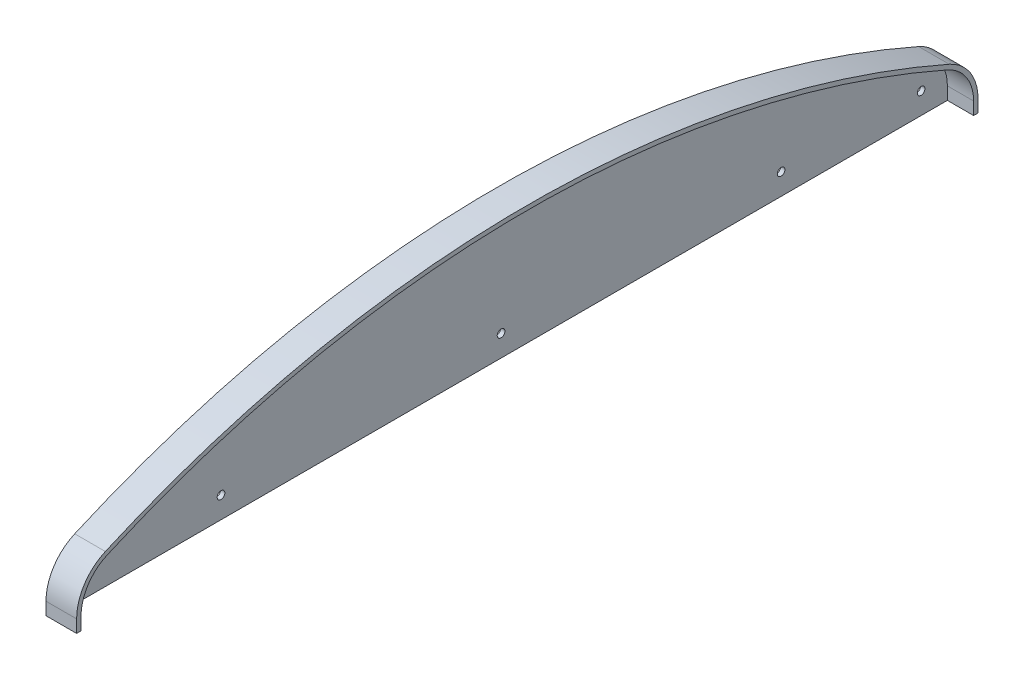
ISO-10303-21;
HEADER;
FILE_DESCRIPTION(('STEP AP214'),'2;1');
FILE_NAME('part.step','',(''),(''),'','','');
FILE_SCHEMA(('AUTOMOTIVE_DESIGN { 1 0 10303 214 1 1 1 1 }'));
ENDSEC;
DATA;
#1=APPLICATION_CONTEXT('core data for automotive mechanical design processes');
#2=APPLICATION_PROTOCOL_DEFINITION('international standard','automotive_design',2000,#1);
#3=PRODUCT_CONTEXT('',#1,'mechanical');
#4=PRODUCT('Part','Part','',(#3));
#5=PRODUCT_RELATED_PRODUCT_CATEGORY('part','',(#4));
#6=PRODUCT_DEFINITION_FORMATION('','',#4);
#7=PRODUCT_DEFINITION_CONTEXT('part definition',#1,'design');
#8=PRODUCT_DEFINITION('design','',#6,#7);
#9=PRODUCT_DEFINITION_SHAPE('','',#8);
#10=(LENGTH_UNIT() NAMED_UNIT(*) SI_UNIT(.MILLI.,.METRE.));
#11=(NAMED_UNIT(*) PLANE_ANGLE_UNIT() SI_UNIT($,.RADIAN.));
#12=(NAMED_UNIT(*) SI_UNIT($,.STERADIAN.) SOLID_ANGLE_UNIT());
#13=UNCERTAINTY_MEASURE_WITH_UNIT(LENGTH_MEASURE(1.E-05),#10,'distance_accuracy_value','');
#14=(GEOMETRIC_REPRESENTATION_CONTEXT(3) GLOBAL_UNCERTAINTY_ASSIGNED_CONTEXT((#13)) GLOBAL_UNIT_ASSIGNED_CONTEXT((#10,
#11,#12)) REPRESENTATION_CONTEXT('',''));
#15=CARTESIAN_POINT('',(0.,0.,0.));
#16=DIRECTION('',(0.,0.,1.));
#17=DIRECTION('',(1.,0.,0.));
#18=AXIS2_PLACEMENT_3D('',#15,#16,#17);
#19=CARTESIAN_POINT('',(28.575,0.,-292.1));
#20=DIRECTION('',(-1.,0.,0.));
#21=DIRECTION('',(0.,0.,1.));
#22=AXIS2_PLACEMENT_3D('',#19,#20,#21);
#23=CYLINDRICAL_SURFACE('',#22,31.75);
#24=CARTESIAN_POINT('',(22.225,0.,-292.1));
#25=DIRECTION('',(-1.,0.,0.));
#26=DIRECTION('',(0.,0.,1.));
#27=AXIS2_PLACEMENT_3D('',#24,#25,#26);
#28=CIRCLE('',#27,31.75);
#29=CARTESIAN_POINT('',(22.225,29.0504808933824,-304.911403508753));
#30=VERTEX_POINT('',#29);
#31=CARTESIAN_POINT('',(22.225,-1.0807521544365E-12,-323.85));
#32=VERTEX_POINT('',#31);
#33=EDGE_CURVE('E114',#30,#32,#28,.T.);
#34=ORIENTED_EDGE('',*,*,#33,.F.);
#35=DIRECTION('',(-1.,0.,0.));
#36=VECTOR('',#35,1.);
#37=CARTESIAN_POINT('',(28.575,29.0504808933932,-304.911403508729));
#38=LINE('',#37,#36);
#39=CARTESIAN_POINT('',(3.175,29.0504808933761,-304.911403508751));
#40=VERTEX_POINT('',#39);
#41=EDGE_CURVE('E102',#30,#40,#38,.T.);
#42=ORIENTED_EDGE('',*,*,#41,.T.);
#43=CARTESIAN_POINT('',(3.175,0.,-292.1));
#44=DIRECTION('',(-1.,0.,0.));
#45=DIRECTION('',(0.,0.,1.));
#46=AXIS2_PLACEMENT_3D('',#43,#44,#45);
#47=CIRCLE('',#46,31.75);
#48=CARTESIAN_POINT('',(3.175,-1.0807521544365E-12,-323.85));
#49=VERTEX_POINT('',#48);
#50=EDGE_CURVE('E118',#49,#40,#47,.F.);
#51=ORIENTED_EDGE('',*,*,#50,.F.);
#52=DIRECTION('',(1.,0.,0.));
#53=VECTOR('',#52,1.);
#54=CARTESIAN_POINT('',(22.225,-2.16150430887301E-12,-323.85));
#55=LINE('',#54,#53);
#56=EDGE_CURVE('E169',#32,#49,#55,.F.);
#57=ORIENTED_EDGE('',*,*,#56,.F.);
#58=EDGE_LOOP('',(#34,#42,#51,#57));
#59=FACE_BOUND('',#58,.T.);
#60=ADVANCED_FACE('F16',(#59),#23,.F.);
#61=CARTESIAN_POINT('',(28.575,-662.350964368574,0.));
#62=DIRECTION('',(-1.,0.,0.));
#63=DIRECTION('',(0.,0.,1.));
#64=AXIS2_PLACEMENT_3D('',#61,#62,#63);
#65=CYLINDRICAL_SURFACE('',#64,755.65);
#66=CARTESIAN_POINT('',(22.225,-662.350964368574,0.));
#67=DIRECTION('',(-1.,0.,0.));
#68=DIRECTION('',(0.,0.,1.));
#69=AXIS2_PLACEMENT_3D('',#66,#67,#68);
#70=CIRCLE('',#69,755.65);
#71=CARTESIAN_POINT('',(22.225,29.0504808933702,304.911403508748));
#72=VERTEX_POINT('',#71);
#73=EDGE_CURVE('E108',#72,#30,#70,.T.);
#74=ORIENTED_EDGE('',*,*,#73,.F.);
#75=DIRECTION('',(-1.,0.,0.));
#76=VECTOR('',#75,1.);
#77=CARTESIAN_POINT('',(28.575,29.0504808933809,304.911403508723));
#78=LINE('',#77,#76);
#79=CARTESIAN_POINT('',(3.175,29.0504808933763,304.911403508751));
#80=VERTEX_POINT('',#79);
#81=EDGE_CURVE('E95',#72,#80,#78,.T.);
#82=ORIENTED_EDGE('',*,*,#81,.T.);
#83=CARTESIAN_POINT('',(3.175,-662.350964368574,0.));
#84=DIRECTION('',(-1.,0.,0.));
#85=DIRECTION('',(0.,0.,1.));
#86=AXIS2_PLACEMENT_3D('',#83,#84,#85);
#87=CIRCLE('',#86,755.65);
#88=EDGE_CURVE('E120',#40,#80,#87,.F.);
#89=ORIENTED_EDGE('',*,*,#88,.F.);
#90=ORIENTED_EDGE('',*,*,#41,.F.);
#91=EDGE_LOOP('',(#74,#82,#89,#90));
#92=FACE_BOUND('',#91,.T.);
#93=ADVANCED_FACE('F112',(#92),#65,.F.);
#94=CARTESIAN_POINT('',(28.575,3.4967584383589E-13,292.1));
#95=DIRECTION('',(-1.,0.,0.));
#96=DIRECTION('',(0.,0.,1.));
#97=AXIS2_PLACEMENT_3D('',#94,#95,#96);
#98=CYLINDRICAL_SURFACE('',#97,31.75);
#99=CARTESIAN_POINT('',(22.225,3.4967584383589E-13,292.1));
#100=DIRECTION('',(-1.,0.,0.));
#101=DIRECTION('',(0.,0.,1.));
#102=AXIS2_PLACEMENT_3D('',#99,#100,#101);
#103=CIRCLE('',#102,31.75);
#104=CARTESIAN_POINT('',(22.225,1.74837921917945E-13,323.85));
#105=VERTEX_POINT('',#104);
#106=EDGE_CURVE('E19',#105,#72,#103,.T.);
#107=ORIENTED_EDGE('',*,*,#106,.F.);
#108=DIRECTION('',(-1.,0.,0.));
#109=VECTOR('',#108,1.);
#110=CARTESIAN_POINT('',(22.225,0.,323.85));
#111=LINE('',#110,#109);
#112=CARTESIAN_POINT('',(3.175,1.74837921917945E-13,323.85));
#113=VERTEX_POINT('',#112);
#114=EDGE_CURVE('E88',#113,#105,#111,.F.);
#115=ORIENTED_EDGE('',*,*,#114,.F.);
#116=CARTESIAN_POINT('',(3.175,3.4967584383589E-13,292.1));
#117=DIRECTION('',(-1.,0.,0.));
#118=DIRECTION('',(0.,0.,1.));
#119=AXIS2_PLACEMENT_3D('',#116,#117,#118);
#120=CIRCLE('',#119,31.75);
#121=EDGE_CURVE('E98',#80,#113,#120,.F.);
#122=ORIENTED_EDGE('',*,*,#121,.F.);
#123=ORIENTED_EDGE('',*,*,#81,.F.);
#124=EDGE_LOOP('',(#107,#115,#122,#123));
#125=FACE_BOUND('',#124,.T.);
#126=ADVANCED_FACE('F97',(#125),#98,.F.);
#127=CARTESIAN_POINT('',(22.225,-9.144,323.85));
#128=DIRECTION('',(0.,0.,-1.));
#129=DIRECTION('',(-1.,0.,0.));
#130=AXIS2_PLACEMENT_3D('',#127,#128,#129);
#131=PLANE('',#130);
#132=DIRECTION('',(1.,0.,0.));
#133=VECTOR('',#132,1.);
#134=CARTESIAN_POINT('',(0.,-9.144,323.85));
#135=LINE('',#134,#133);
#136=CARTESIAN_POINT('',(3.175,-9.144,323.85));
#137=VERTEX_POINT('',#136);
#138=CARTESIAN_POINT('',(22.225,-9.144,323.85));
#139=VERTEX_POINT('',#138);
#140=EDGE_CURVE('E182',#137,#139,#135,.T.);
#141=ORIENTED_EDGE('',*,*,#140,.F.);
#142=DIRECTION('',(0.,1.,0.));
#143=VECTOR('',#142,1.);
#144=CARTESIAN_POINT('',(3.175,0.,323.85));
#145=LINE('',#144,#143);
#146=EDGE_CURVE('E124',#113,#137,#145,.F.);
#147=ORIENTED_EDGE('',*,*,#146,.F.);
#148=ORIENTED_EDGE('',*,*,#114,.T.);
#149=DIRECTION('',(0.,1.,0.));
#150=VECTOR('',#149,1.);
#151=CARTESIAN_POINT('',(22.225,-9.144,323.85));
#152=LINE('',#151,#150);
#153=EDGE_CURVE('E111',#139,#105,#152,.T.);
#154=ORIENTED_EDGE('',*,*,#153,.F.);
#155=EDGE_LOOP('',(#141,#147,#148,#154));
#156=FACE_BOUND('',#155,.T.);
#157=ADVANCED_FACE('F285',(#156),#131,.T.);
#158=CARTESIAN_POINT('',(22.225,3.89155374591682E-13,-323.85));
#159=DIRECTION('',(0.,0.,1.));
#160=DIRECTION('',(1.,0.,0.));
#161=AXIS2_PLACEMENT_3D('',#158,#159,#160);
#162=PLANE('',#161);
#163=ORIENTED_EDGE('',*,*,#56,.T.);
#164=DIRECTION('',(0.,1.,0.));
#165=VECTOR('',#164,1.);
#166=CARTESIAN_POINT('',(3.175,0.,-323.85));
#167=LINE('',#166,#165);
#168=CARTESIAN_POINT('',(3.175,-9.144,-323.85));
#169=VERTEX_POINT('',#168);
#170=EDGE_CURVE('E121',#169,#49,#167,.T.);
#171=ORIENTED_EDGE('',*,*,#170,.F.);
#172=DIRECTION('',(1.,0.,0.));
#173=VECTOR('',#172,1.);
#174=CARTESIAN_POINT('',(0.,-9.144,-323.85));
#175=LINE('',#174,#173);
#176=CARTESIAN_POINT('',(22.225,-9.144,-323.85));
#177=VERTEX_POINT('',#176);
#178=EDGE_CURVE('E179',#177,#169,#175,.F.);
#179=ORIENTED_EDGE('',*,*,#178,.F.);
#180=DIRECTION('',(0.,1.,0.));
#181=VECTOR('',#180,1.);
#182=CARTESIAN_POINT('',(22.225,-9.144,-323.85));
#183=LINE('',#182,#181);
#184=EDGE_CURVE('E115',#32,#177,#183,.F.);
#185=ORIENTED_EDGE('',*,*,#184,.F.);
#186=EDGE_LOOP('',(#163,#171,#179,#185));
#187=FACE_BOUND('',#186,.T.);
#188=ADVANCED_FACE('F278',(#187),#162,.T.);
#189=CARTESIAN_POINT('',(22.225,-9.144,327.025));
#190=DIRECTION('',(1.,0.,0.));
#191=DIRECTION('',(0.,0.,-1.));
#192=AXIS2_PLACEMENT_3D('',#189,#190,#191);
#193=PLANE('',#192);
#194=DIRECTION('',(0.,1.,0.));
#195=VECTOR('',#194,1.);
#196=CARTESIAN_POINT('',(22.225,0.,327.025));
#197=LINE('',#196,#195);
#198=CARTESIAN_POINT('',(22.225,-9.144,327.025));
#199=VERTEX_POINT('',#198);
#200=CARTESIAN_POINT('',(22.225,0.,327.025));
#201=VERTEX_POINT('',#200);
#202=EDGE_CURVE('E194',#199,#201,#197,.T.);
#203=ORIENTED_EDGE('',*,*,#202,.F.);
#204=DIRECTION('',(0.,0.,-1.));
#205=VECTOR('',#204,1.);
#206=CARTESIAN_POINT('',(22.225,-9.144,327.025));
#207=LINE('',#206,#205);
#208=EDGE_CURVE('E185',#139,#199,#207,.F.);
#209=ORIENTED_EDGE('',*,*,#208,.F.);
#210=ORIENTED_EDGE('',*,*,#153,.T.);
#211=ORIENTED_EDGE('',*,*,#106,.T.);
#212=ORIENTED_EDGE('',*,*,#73,.T.);
#213=ORIENTED_EDGE('',*,*,#33,.T.);
#214=ORIENTED_EDGE('',*,*,#184,.T.);
#215=DIRECTION('',(0.,0.,-1.));
#216=VECTOR('',#215,1.);
#217=CARTESIAN_POINT('',(22.225,-9.144,327.025));
#218=LINE('',#217,#216);
#219=CARTESIAN_POINT('',(22.225,-9.144,-327.025));
#220=VERTEX_POINT('',#219);
#221=EDGE_CURVE('E200',#220,#177,#218,.F.);
#222=ORIENTED_EDGE('',*,*,#221,.F.);
#223=DIRECTION('',(0.,1.,0.));
#224=VECTOR('',#223,1.);
#225=CARTESIAN_POINT('',(22.225,-9.144,-327.025));
#226=LINE('',#225,#224);
#227=CARTESIAN_POINT('',(22.225,0.,-327.025));
#228=VERTEX_POINT('',#227);
#229=EDGE_CURVE('E178',#228,#220,#226,.F.);
#230=ORIENTED_EDGE('',*,*,#229,.F.);
#231=CARTESIAN_POINT('',(22.225,0.,-292.1));
#232=DIRECTION('',(1.,0.,0.));
#233=DIRECTION('',(0.,0.,-1.));
#234=AXIS2_PLACEMENT_3D('',#231,#232,#233);
#235=CIRCLE('',#234,34.925);
#236=CARTESIAN_POINT('',(22.225,31.9555289827176,-306.192543859615));
#237=VERTEX_POINT('',#236);
#238=EDGE_CURVE('E130',#237,#228,#235,.F.);
#239=ORIENTED_EDGE('',*,*,#238,.F.);
#240=CARTESIAN_POINT('',(22.225,-662.350964368574,0.));
#241=DIRECTION('',(1.,0.,0.));
#242=DIRECTION('',(0.,0.,-1.));
#243=AXIS2_PLACEMENT_3D('',#240,#241,#242);
#244=CIRCLE('',#243,758.825);
#245=CARTESIAN_POINT('',(22.225,31.9555289827113,306.192543859612));
#246=VERTEX_POINT('',#245);
#247=EDGE_CURVE('E125',#246,#237,#244,.F.);
#248=ORIENTED_EDGE('',*,*,#247,.F.);
#249=CARTESIAN_POINT('',(22.225,0.,292.1));
#250=DIRECTION('',(1.,0.,0.));
#251=DIRECTION('',(0.,0.,-1.));
#252=AXIS2_PLACEMENT_3D('',#249,#250,#251);
#253=CIRCLE('',#252,34.925);
#254=EDGE_CURVE('E127',#201,#246,#253,.F.);
#255=ORIENTED_EDGE('',*,*,#254,.F.);
#256=EDGE_LOOP('',(#203,#209,#210,#211,#212,#213,#214,#222,#230,#239,#248,#255));
#257=FACE_BOUND('',#256,.T.);
#258=ADVANCED_FACE('F107',(#257),#193,.T.);
#259=CARTESIAN_POINT('',(3.175,0.,0.));
#260=DIRECTION('',(1.,0.,0.));
#261=DIRECTION('',(0.,0.,-1.));
#262=AXIS2_PLACEMENT_3D('',#259,#260,#261);
#263=PLANE('',#262);
#264=CARTESIAN_POINT('',(3.175,6.35,-203.2));
#265=DIRECTION('',(-1.,0.,0.));
#266=DIRECTION('',(0.,0.,1.));
#267=AXIS2_PLACEMENT_3D('',#264,#265,#266);
#268=CIRCLE('',#267,2.7813);
#269=CARTESIAN_POINT('',(3.175,6.35,-200.4187));
#270=VERTEX_POINT('',#269);
#271=EDGE_CURVE('E145',#270,#270,#268,.T.);
#272=ORIENTED_EDGE('',*,*,#271,.T.);
#273=EDGE_LOOP('',(#272));
#274=FACE_BOUND('',#273,.T.);
#275=CARTESIAN_POINT('',(3.175,6.35,-304.8));
#276=DIRECTION('',(-1.,0.,0.));
#277=DIRECTION('',(0.,0.,1.));
#278=AXIS2_PLACEMENT_3D('',#275,#276,#277);
#279=CIRCLE('',#278,2.7813);
#280=CARTESIAN_POINT('',(3.175,6.35,-302.0187));
#281=VERTEX_POINT('',#280);
#282=EDGE_CURVE('E142',#281,#281,#279,.T.);
#283=ORIENTED_EDGE('',*,*,#282,.T.);
#284=EDGE_LOOP('',(#283));
#285=FACE_BOUND('',#284,.T.);
#286=CARTESIAN_POINT('',(3.175,6.35,203.2));
#287=DIRECTION('',(-1.,0.,0.));
#288=DIRECTION('',(0.,0.,1.));
#289=AXIS2_PLACEMENT_3D('',#286,#287,#288);
#290=CIRCLE('',#289,2.7813);
#291=CARTESIAN_POINT('',(3.175,6.35,205.9813));
#292=VERTEX_POINT('',#291);
#293=EDGE_CURVE('E139',#292,#292,#290,.T.);
#294=ORIENTED_EDGE('',*,*,#293,.T.);
#295=EDGE_LOOP('',(#294));
#296=FACE_BOUND('',#295,.T.);
#297=CARTESIAN_POINT('',(3.175,6.35,304.8));
#298=DIRECTION('',(-1.,0.,0.));
#299=DIRECTION('',(0.,0.,1.));
#300=AXIS2_PLACEMENT_3D('',#297,#298,#299);
#301=CIRCLE('',#300,2.7813);
#302=CARTESIAN_POINT('',(3.175,6.35,307.5813));
#303=VERTEX_POINT('',#302);
#304=EDGE_CURVE('E136',#303,#303,#301,.T.);
#305=ORIENTED_EDGE('',*,*,#304,.T.);
#306=EDGE_LOOP('',(#305));
#307=FACE_BOUND('',#306,.T.);
#308=CARTESIAN_POINT('',(3.175,6.35,0.));
#309=DIRECTION('',(-1.,0.,0.));
#310=DIRECTION('',(0.,0.,1.));
#311=AXIS2_PLACEMENT_3D('',#308,#309,#310);
#312=CIRCLE('',#311,2.7813);
#313=CARTESIAN_POINT('',(3.175,6.35,2.7813));
#314=VERTEX_POINT('',#313);
#315=EDGE_CURVE('E133',#314,#314,#312,.T.);
#316=ORIENTED_EDGE('',*,*,#315,.T.);
#317=EDGE_LOOP('',(#316));
#318=FACE_BOUND('',#317,.T.);
#319=ORIENTED_EDGE('',*,*,#121,.T.);
#320=ORIENTED_EDGE('',*,*,#146,.T.);
#321=DIRECTION('',(0.,0.,-1.));
#322=VECTOR('',#321,1.);
#323=CARTESIAN_POINT('',(3.175,-9.144,327.025));
#324=LINE('',#323,#322);
#325=EDGE_CURVE('E175',#169,#137,#324,.F.);
#326=ORIENTED_EDGE('',*,*,#325,.F.);
#327=ORIENTED_EDGE('',*,*,#170,.T.);
#328=ORIENTED_EDGE('',*,*,#50,.T.);
#329=ORIENTED_EDGE('',*,*,#88,.T.);
#330=EDGE_LOOP('',(#319,#320,#326,#327,#328,#329));
#331=FACE_BOUND('',#330,.T.);
#332=ADVANCED_FACE('F283',(#274,#285,#296,#307,#318,#331),#263,.T.);
#333=CARTESIAN_POINT('',(0.,-662.350964368574,0.));
#334=DIRECTION('',(1.,0.,0.));
#335=DIRECTION('',(0.,0.,-1.));
#336=AXIS2_PLACEMENT_3D('',#333,#334,#335);
#337=CYLINDRICAL_SURFACE('',#336,758.825);
#338=ORIENTED_EDGE('',*,*,#247,.T.);
#339=DIRECTION('',(1.,0.,0.));
#340=VECTOR('',#339,1.);
#341=CARTESIAN_POINT('',(0.,31.9555289827276,-306.192543859575));
#342=LINE('',#341,#340);
#343=CARTESIAN_POINT('',(0.,31.9555289827176,-306.192543859615));
#344=VERTEX_POINT('',#343);
#345=EDGE_CURVE('E132',#344,#237,#342,.T.);
#346=ORIENTED_EDGE('',*,*,#345,.F.);
#347=CARTESIAN_POINT('',(0.,-662.350964368574,0.));
#348=DIRECTION('',(1.,0.,0.));
#349=DIRECTION('',(0.,0.,-1.));
#350=AXIS2_PLACEMENT_3D('',#347,#348,#349);
#351=CIRCLE('',#350,758.825);
#352=CARTESIAN_POINT('',(0.,31.9555289827113,306.192543859612));
#353=VERTEX_POINT('',#352);
#354=EDGE_CURVE('E148',#344,#353,#351,.T.);
#355=ORIENTED_EDGE('',*,*,#354,.T.);
#356=DIRECTION('',(1.,0.,0.));
#357=VECTOR('',#356,1.);
#358=CARTESIAN_POINT('',(0.,31.9555289827276,306.192543859575));
#359=LINE('',#358,#357);
#360=EDGE_CURVE('E129',#246,#353,#359,.F.);
#361=ORIENTED_EDGE('',*,*,#360,.F.);
#362=EDGE_LOOP('',(#338,#346,#355,#361));
#363=FACE_BOUND('',#362,.T.);
#364=ADVANCED_FACE('F294',(#363),#337,.T.);
#365=CARTESIAN_POINT('',(0.,0.,292.1));
#366=DIRECTION('',(1.,0.,0.));
#367=DIRECTION('',(0.,0.,-1.));
#368=AXIS2_PLACEMENT_3D('',#365,#366,#367);
#369=CYLINDRICAL_SURFACE('',#368,34.925);
#370=ORIENTED_EDGE('',*,*,#254,.T.);
#371=ORIENTED_EDGE('',*,*,#360,.T.);
#372=CARTESIAN_POINT('',(0.,0.,292.1));
#373=DIRECTION('',(1.,0.,0.));
#374=DIRECTION('',(0.,0.,-1.));
#375=AXIS2_PLACEMENT_3D('',#372,#373,#374);
#376=CIRCLE('',#375,34.925);
#377=CARTESIAN_POINT('',(0.,0.,327.025));
#378=VERTEX_POINT('',#377);
#379=EDGE_CURVE('E151',#353,#378,#376,.T.);
#380=ORIENTED_EDGE('',*,*,#379,.T.);
#381=DIRECTION('',(1.,0.,0.));
#382=VECTOR('',#381,1.);
#383=CARTESIAN_POINT('',(0.,0.,327.025));
#384=LINE('',#383,#382);
#385=EDGE_CURVE('E186',#201,#378,#384,.F.);
#386=ORIENTED_EDGE('',*,*,#385,.F.);
#387=EDGE_LOOP('',(#370,#371,#380,#386));
#388=FACE_BOUND('',#387,.T.);
#389=ADVANCED_FACE('F290',(#388),#369,.T.);
#390=CARTESIAN_POINT('',(0.,0.,327.025));
#391=DIRECTION('',(0.,0.,1.));
#392=DIRECTION('',(1.,0.,0.));
#393=AXIS2_PLACEMENT_3D('',#390,#391,#392);
#394=PLANE('',#393);
#395=ORIENTED_EDGE('',*,*,#202,.T.);
#396=ORIENTED_EDGE('',*,*,#385,.T.);
#397=DIRECTION('',(0.,1.,0.));
#398=VECTOR('',#397,1.);
#399=CARTESIAN_POINT('',(0.,0.,327.025));
#400=LINE('',#399,#398);
#401=CARTESIAN_POINT('',(0.,-9.144,327.025));
#402=VERTEX_POINT('',#401);
#403=EDGE_CURVE('E154',#378,#402,#400,.F.);
#404=ORIENTED_EDGE('',*,*,#403,.T.);
#405=DIRECTION('',(1.,0.,0.));
#406=VECTOR('',#405,1.);
#407=CARTESIAN_POINT('',(0.,-9.144,327.025));
#408=LINE('',#407,#406);
#409=EDGE_CURVE('E191',#199,#402,#408,.F.);
#410=ORIENTED_EDGE('',*,*,#409,.F.);
#411=EDGE_LOOP('',(#395,#396,#404,#410));
#412=FACE_BOUND('',#411,.T.);
#413=ADVANCED_FACE('F263',(#412),#394,.T.);
#414=CARTESIAN_POINT('',(0.,-9.144,327.025));
#415=DIRECTION('',(0.,-1.,0.));
#416=DIRECTION('',(0.,0.,-1.));
#417=AXIS2_PLACEMENT_3D('',#414,#415,#416);
#418=PLANE('',#417);
#419=ORIENTED_EDGE('',*,*,#178,.T.);
#420=ORIENTED_EDGE('',*,*,#325,.T.);
#421=ORIENTED_EDGE('',*,*,#140,.T.);
#422=ORIENTED_EDGE('',*,*,#208,.T.);
#423=ORIENTED_EDGE('',*,*,#409,.T.);
#424=DIRECTION('',(0.,0.,-1.));
#425=VECTOR('',#424,1.);
#426=CARTESIAN_POINT('',(0.,-9.144,0.));
#427=LINE('',#426,#425);
#428=CARTESIAN_POINT('',(0.,-9.144,-327.025));
#429=VERTEX_POINT('',#428);
#430=EDGE_CURVE('E233',#402,#429,#427,.T.);
#431=ORIENTED_EDGE('',*,*,#430,.T.);
#432=DIRECTION('',(-1.,0.,0.));
#433=VECTOR('',#432,1.);
#434=CARTESIAN_POINT('',(0.,-9.144,-327.025));
#435=LINE('',#434,#433);
#436=EDGE_CURVE('E216',#220,#429,#435,.T.);
#437=ORIENTED_EDGE('',*,*,#436,.F.);
#438=ORIENTED_EDGE('',*,*,#221,.T.);
#439=EDGE_LOOP('',(#419,#420,#421,#422,#423,#431,#437,#438));
#440=FACE_BOUND('',#439,.T.);
#441=ADVANCED_FACE('F258',(#440),#418,.T.);
#442=CARTESIAN_POINT('',(0.,-9.144,-327.025));
#443=DIRECTION('',(0.,0.,-1.));
#444=DIRECTION('',(-1.,0.,0.));
#445=AXIS2_PLACEMENT_3D('',#442,#443,#444);
#446=PLANE('',#445);
#447=ORIENTED_EDGE('',*,*,#229,.T.);
#448=ORIENTED_EDGE('',*,*,#436,.T.);
#449=DIRECTION('',(0.,1.,0.));
#450=VECTOR('',#449,1.);
#451=CARTESIAN_POINT('',(0.,0.,-327.025));
#452=LINE('',#451,#450);
#453=CARTESIAN_POINT('',(0.,0.,-327.025));
#454=VERTEX_POINT('',#453);
#455=EDGE_CURVE('E158',#429,#454,#452,.T.);
#456=ORIENTED_EDGE('',*,*,#455,.T.);
#457=DIRECTION('',(1.,0.,0.));
#458=VECTOR('',#457,1.);
#459=CARTESIAN_POINT('',(0.,0.,-327.025));
#460=LINE('',#459,#458);
#461=EDGE_CURVE('E34',#228,#454,#460,.F.);
#462=ORIENTED_EDGE('',*,*,#461,.F.);
#463=EDGE_LOOP('',(#447,#448,#456,#462));
#464=FACE_BOUND('',#463,.T.);
#465=ADVANCED_FACE('F251',(#464),#446,.T.);
#466=CARTESIAN_POINT('',(0.,0.,-292.1));
#467=DIRECTION('',(1.,0.,0.));
#468=DIRECTION('',(0.,0.,-1.));
#469=AXIS2_PLACEMENT_3D('',#466,#467,#468);
#470=CYLINDRICAL_SURFACE('',#469,34.925);
#471=ORIENTED_EDGE('',*,*,#238,.T.);
#472=ORIENTED_EDGE('',*,*,#461,.T.);
#473=CARTESIAN_POINT('',(0.,0.,-292.1));
#474=DIRECTION('',(1.,0.,0.));
#475=DIRECTION('',(0.,0.,-1.));
#476=AXIS2_PLACEMENT_3D('',#473,#474,#475);
#477=CIRCLE('',#476,34.925);
#478=EDGE_CURVE('E155',#454,#344,#477,.T.);
#479=ORIENTED_EDGE('',*,*,#478,.T.);
#480=ORIENTED_EDGE('',*,*,#345,.T.);
#481=EDGE_LOOP('',(#471,#472,#479,#480));
#482=FACE_BOUND('',#481,.T.);
#483=ADVANCED_FACE('F295',(#482),#470,.T.);
#484=CARTESIAN_POINT('',(0.,6.35,0.));
#485=DIRECTION('',(-1.,0.,0.));
#486=DIRECTION('',(0.,0.,1.));
#487=AXIS2_PLACEMENT_3D('',#484,#485,#486);
#488=CYLINDRICAL_SURFACE('',#487,2.7813);
#489=ORIENTED_EDGE('',*,*,#315,.F.);
#490=EDGE_LOOP('',(#489));
#491=FACE_BOUND('',#490,.T.);
#492=CARTESIAN_POINT('',(0.,6.35,0.));
#493=DIRECTION('',(-1.,0.,0.));
#494=DIRECTION('',(0.,0.,1.));
#495=AXIS2_PLACEMENT_3D('',#492,#493,#494);
#496=CIRCLE('',#495,2.7813);
#497=CARTESIAN_POINT('',(0.,6.35,2.7813));
#498=VERTEX_POINT('',#497);
#499=EDGE_CURVE('E157',#498,#498,#496,.T.);
#500=ORIENTED_EDGE('',*,*,#499,.T.);
#501=EDGE_LOOP('',(#500));
#502=FACE_BOUND('',#501,.T.);
#503=ADVANCED_FACE('F297',(#491,#502),#488,.F.);
#504=CARTESIAN_POINT('',(0.,6.35,304.8));
#505=DIRECTION('',(-1.,0.,0.));
#506=DIRECTION('',(0.,0.,1.));
#507=AXIS2_PLACEMENT_3D('',#504,#505,#506);
#508=CYLINDRICAL_SURFACE('',#507,2.7813);
#509=ORIENTED_EDGE('',*,*,#304,.F.);
#510=EDGE_LOOP('',(#509));
#511=FACE_BOUND('',#510,.T.);
#512=CARTESIAN_POINT('',(0.,6.35,304.8));
#513=DIRECTION('',(-1.,0.,0.));
#514=DIRECTION('',(0.,0.,1.));
#515=AXIS2_PLACEMENT_3D('',#512,#513,#514);
#516=CIRCLE('',#515,2.7813);
#517=CARTESIAN_POINT('',(0.,6.35,307.5813));
#518=VERTEX_POINT('',#517);
#519=EDGE_CURVE('E161',#518,#518,#516,.T.);
#520=ORIENTED_EDGE('',*,*,#519,.T.);
#521=EDGE_LOOP('',(#520));
#522=FACE_BOUND('',#521,.T.);
#523=ADVANCED_FACE('F304',(#511,#522),#508,.F.);
#524=CARTESIAN_POINT('',(0.,6.35,203.2));
#525=DIRECTION('',(-1.,0.,0.));
#526=DIRECTION('',(0.,0.,1.));
#527=AXIS2_PLACEMENT_3D('',#524,#525,#526);
#528=CYLINDRICAL_SURFACE('',#527,2.7813);
#529=ORIENTED_EDGE('',*,*,#293,.F.);
#530=EDGE_LOOP('',(#529));
#531=FACE_BOUND('',#530,.T.);
#532=CARTESIAN_POINT('',(0.,6.35,203.2));
#533=DIRECTION('',(-1.,0.,0.));
#534=DIRECTION('',(0.,0.,1.));
#535=AXIS2_PLACEMENT_3D('',#532,#533,#534);
#536=CIRCLE('',#535,2.7813);
#537=CARTESIAN_POINT('',(0.,6.35,205.9813));
#538=VERTEX_POINT('',#537);
#539=EDGE_CURVE('E164',#538,#538,#536,.T.);
#540=ORIENTED_EDGE('',*,*,#539,.T.);
#541=EDGE_LOOP('',(#540));
#542=FACE_BOUND('',#541,.T.);
#543=ADVANCED_FACE('F323',(#531,#542),#528,.F.);
#544=CARTESIAN_POINT('',(0.,6.35,-304.8));
#545=DIRECTION('',(-1.,0.,0.));
#546=DIRECTION('',(0.,0.,1.));
#547=AXIS2_PLACEMENT_3D('',#544,#545,#546);
#548=CYLINDRICAL_SURFACE('',#547,2.7813);
#549=ORIENTED_EDGE('',*,*,#282,.F.);
#550=EDGE_LOOP('',(#549));
#551=FACE_BOUND('',#550,.T.);
#552=CARTESIAN_POINT('',(0.,6.35,-304.8));
#553=DIRECTION('',(-1.,0.,0.));
#554=DIRECTION('',(0.,0.,1.));
#555=AXIS2_PLACEMENT_3D('',#552,#553,#554);
#556=CIRCLE('',#555,2.7813);
#557=CARTESIAN_POINT('',(0.,6.35,-302.0187));
#558=VERTEX_POINT('',#557);
#559=EDGE_CURVE('E25',#558,#558,#556,.T.);
#560=ORIENTED_EDGE('',*,*,#559,.T.);
#561=EDGE_LOOP('',(#560));
#562=FACE_BOUND('',#561,.T.);
#563=ADVANCED_FACE('F315',(#551,#562),#548,.F.);
#564=CARTESIAN_POINT('',(0.,6.35,-203.2));
#565=DIRECTION('',(-1.,0.,0.));
#566=DIRECTION('',(0.,0.,1.));
#567=AXIS2_PLACEMENT_3D('',#564,#565,#566);
#568=CYLINDRICAL_SURFACE('',#567,2.7813);
#569=ORIENTED_EDGE('',*,*,#271,.F.);
#570=EDGE_LOOP('',(#569));
#571=FACE_BOUND('',#570,.T.);
#572=CARTESIAN_POINT('',(0.,6.35,-203.2));
#573=DIRECTION('',(-1.,0.,0.));
#574=DIRECTION('',(0.,0.,1.));
#575=AXIS2_PLACEMENT_3D('',#572,#573,#574);
#576=CIRCLE('',#575,2.7813);
#577=CARTESIAN_POINT('',(0.,6.35,-200.4187));
#578=VERTEX_POINT('',#577);
#579=EDGE_CURVE('E11',#578,#578,#576,.T.);
#580=ORIENTED_EDGE('',*,*,#579,.T.);
#581=EDGE_LOOP('',(#580));
#582=FACE_BOUND('',#581,.T.);
#583=ADVANCED_FACE('F309',(#571,#582),#568,.F.);
#584=CARTESIAN_POINT('',(0.,0.,0.));
#585=DIRECTION('',(1.,0.,0.));
#586=DIRECTION('',(0.,0.,-1.));
#587=AXIS2_PLACEMENT_3D('',#584,#585,#586);
#588=PLANE('',#587);
#589=ORIENTED_EDGE('',*,*,#579,.F.);
#590=EDGE_LOOP('',(#589));
#591=FACE_BOUND('',#590,.T.);
#592=ORIENTED_EDGE('',*,*,#559,.F.);
#593=EDGE_LOOP('',(#592));
#594=FACE_BOUND('',#593,.T.);
#595=ORIENTED_EDGE('',*,*,#539,.F.);
#596=EDGE_LOOP('',(#595));
#597=FACE_BOUND('',#596,.T.);
#598=ORIENTED_EDGE('',*,*,#519,.F.);
#599=EDGE_LOOP('',(#598));
#600=FACE_BOUND('',#599,.T.);
#601=ORIENTED_EDGE('',*,*,#499,.F.);
#602=EDGE_LOOP('',(#601));
#603=FACE_BOUND('',#602,.T.);
#604=ORIENTED_EDGE('',*,*,#455,.F.);
#605=ORIENTED_EDGE('',*,*,#430,.F.);
#606=ORIENTED_EDGE('',*,*,#403,.F.);
#607=ORIENTED_EDGE('',*,*,#379,.F.);
#608=ORIENTED_EDGE('',*,*,#354,.F.);
#609=ORIENTED_EDGE('',*,*,#478,.F.);
#610=EDGE_LOOP('',(#604,#605,#606,#607,#608,#609));
#611=FACE_BOUND('',#610,.T.);
#612=ADVANCED_FACE('F255',(#591,#594,#597,#600,#603,#611),#588,.F.);
#613=CLOSED_SHELL('',(#60,#93,#126,#157,#188,#258,#332,#364,#389,#413,#441,#465,#483,#503,#523,
#543,#563,#583,#612));
#614=MANIFOLD_SOLID_BREP('B1',#613);
#615=ADVANCED_BREP_SHAPE_REPRESENTATION('',(#18,#614),#14);
#616=SHAPE_DEFINITION_REPRESENTATION(#9,#615);
ENDSEC;
END-ISO-10303-21;
